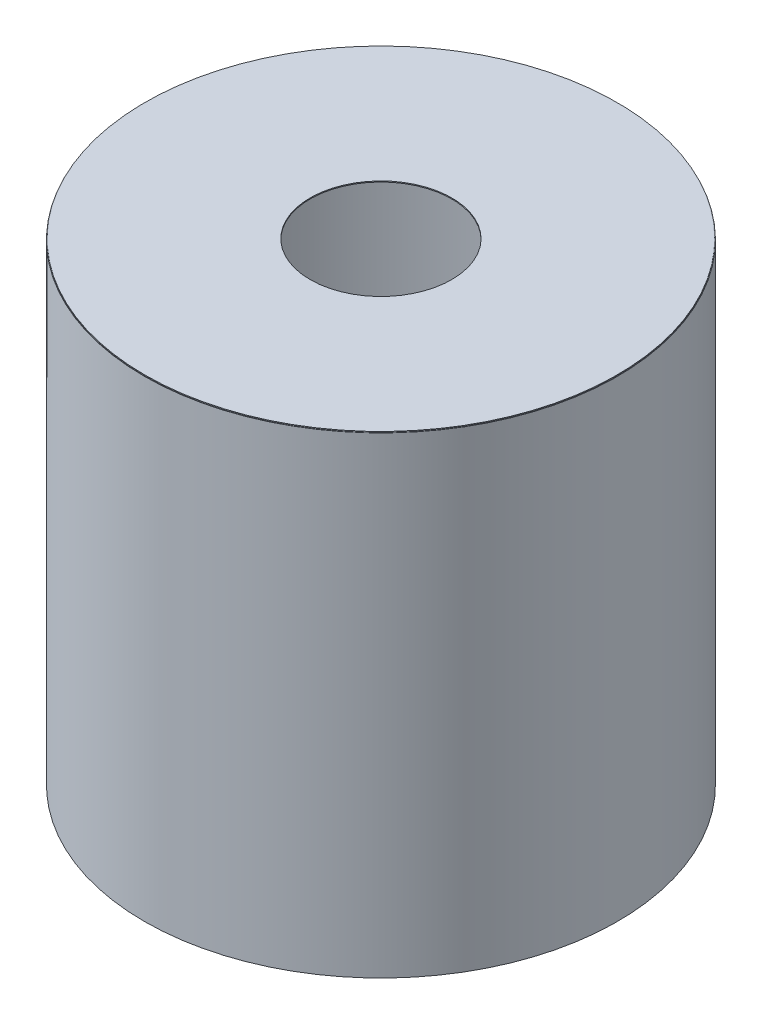
ISO-10303-21;
HEADER;
FILE_DESCRIPTION(('STEP AP214'),'2;1');
FILE_NAME('part.step','',(''),(''),'','','');
FILE_SCHEMA(('AUTOMOTIVE_DESIGN { 1 0 10303 214 1 1 1 1 }'));
ENDSEC;
DATA;
#1=APPLICATION_CONTEXT('core data for automotive mechanical design processes');
#2=APPLICATION_PROTOCOL_DEFINITION('international standard','automotive_design',2000,#1);
#3=PRODUCT_CONTEXT('',#1,'mechanical');
#4=PRODUCT('Part','Part','',(#3));
#5=PRODUCT_RELATED_PRODUCT_CATEGORY('part','',(#4));
#6=PRODUCT_DEFINITION_FORMATION('','',#4);
#7=PRODUCT_DEFINITION_CONTEXT('part definition',#1,'design');
#8=PRODUCT_DEFINITION('design','',#6,#7);
#9=PRODUCT_DEFINITION_SHAPE('','',#8);
#10=(LENGTH_UNIT() NAMED_UNIT(*) SI_UNIT(.MILLI.,.METRE.));
#11=(NAMED_UNIT(*) PLANE_ANGLE_UNIT() SI_UNIT($,.RADIAN.));
#12=(NAMED_UNIT(*) SI_UNIT($,.STERADIAN.) SOLID_ANGLE_UNIT());
#13=UNCERTAINTY_MEASURE_WITH_UNIT(LENGTH_MEASURE(1.E-05),#10,'distance_accuracy_value','');
#14=(GEOMETRIC_REPRESENTATION_CONTEXT(3) GLOBAL_UNCERTAINTY_ASSIGNED_CONTEXT((#13)) GLOBAL_UNIT_ASSIGNED_CONTEXT((#10,
#11,#12)) REPRESENTATION_CONTEXT('',''));
#15=CARTESIAN_POINT('',(0.,0.,0.));
#16=DIRECTION('',(0.,0.,1.));
#17=DIRECTION('',(1.,0.,0.));
#18=AXIS2_PLACEMENT_3D('',#15,#16,#17);
#19=CARTESIAN_POINT('',(0.,1202.,0.));
#20=DIRECTION('',(0.,1.,0.));
#21=DIRECTION('',(0.,0.,1.));
#22=AXIS2_PLACEMENT_3D('',#19,#20,#21);
#23=PLANE('',#22);
#24=CARTESIAN_POINT('',(0.,1202.,0.));
#25=DIRECTION('',(0.,1.,0.));
#26=DIRECTION('',(0.,0.,1.));
#27=AXIS2_PLACEMENT_3D('',#24,#25,#26);
#28=CIRCLE('',#27,450.);
#29=CARTESIAN_POINT('',(0.,1202.,450.));
#30=VERTEX_POINT('',#29);
#31=EDGE_CURVE('E12',#30,#30,#28,.T.);
#32=ORIENTED_EDGE('',*,*,#31,.T.);
#33=EDGE_LOOP('',(#32));
#34=FACE_BOUND('',#33,.T.);
#35=CARTESIAN_POINT('',(0.,1202.,0.));
#36=DIRECTION('',(0.,1.,0.));
#37=DIRECTION('',(0.,0.,1.));
#38=AXIS2_PLACEMENT_3D('',#35,#36,#37);
#39=CIRCLE('',#38,100.);
#40=CARTESIAN_POINT('',(0.,1202.,100.));
#41=VERTEX_POINT('',#40);
#42=EDGE_CURVE('E62',#41,#41,#39,.T.);
#43=ORIENTED_EDGE('',*,*,#42,.F.);
#44=EDGE_LOOP('',(#43));
#45=FACE_BOUND('',#44,.T.);
#46=ADVANCED_FACE('F51',(#34,#45),#23,.T.);
#47=CARTESIAN_POINT('',(0.,1200.,0.));
#48=DIRECTION('',(0.,1.,0.));
#49=DIRECTION('',(0.,0.,1.));
#50=AXIS2_PLACEMENT_3D('',#47,#48,#49);
#51=PLANE('',#50);
#52=CARTESIAN_POINT('',(0.,1200.,0.));
#53=DIRECTION('',(0.,1.,0.));
#54=DIRECTION('',(0.,0.,1.));
#55=AXIS2_PLACEMENT_3D('',#52,#53,#54);
#56=CIRCLE('',#55,450.);
#57=CARTESIAN_POINT('',(0.,1200.,450.));
#58=VERTEX_POINT('',#57);
#59=EDGE_CURVE('E55',#58,#58,#56,.T.);
#60=ORIENTED_EDGE('',*,*,#59,.F.);
#61=EDGE_LOOP('',(#60));
#62=FACE_BOUND('',#61,.T.);
#63=CARTESIAN_POINT('',(0.,1200.,0.));
#64=DIRECTION('',(0.,1.,0.));
#65=DIRECTION('',(0.,0.,1.));
#66=AXIS2_PLACEMENT_3D('',#63,#64,#65);
#67=CIRCLE('',#66,100.);
#68=CARTESIAN_POINT('',(0.,1200.,100.));
#69=VERTEX_POINT('',#68);
#70=EDGE_CURVE('E64',#69,#69,#67,.T.);
#71=ORIENTED_EDGE('',*,*,#70,.T.);
#72=EDGE_LOOP('',(#71));
#73=FACE_BOUND('',#72,.T.);
#74=ADVANCED_FACE('F74',(#62,#73),#51,.F.);
#75=CARTESIAN_POINT('',(0.,1202.,0.));
#76=DIRECTION('',(0.,-1.,0.));
#77=DIRECTION('',(0.,0.,-1.));
#78=AXIS2_PLACEMENT_3D('',#75,#76,#77);
#79=CYLINDRICAL_SURFACE('',#78,450.);
#80=ORIENTED_EDGE('',*,*,#31,.F.);
#81=EDGE_LOOP('',(#80));
#82=FACE_BOUND('',#81,.T.);
#83=ORIENTED_EDGE('',*,*,#59,.T.);
#84=EDGE_LOOP('',(#83));
#85=FACE_BOUND('',#84,.T.);
#86=ADVANCED_FACE('F53',(#82,#85),#79,.T.);
#87=CARTESIAN_POINT('',(0.,1202.,0.));
#88=DIRECTION('',(0.,-1.,0.));
#89=DIRECTION('',(0.,0.,-1.));
#90=AXIS2_PLACEMENT_3D('',#87,#88,#89);
#91=CYLINDRICAL_SURFACE('',#90,100.);
#92=ORIENTED_EDGE('',*,*,#42,.T.);
#93=EDGE_LOOP('',(#92));
#94=FACE_BOUND('',#93,.T.);
#95=ORIENTED_EDGE('',*,*,#70,.F.);
#96=EDGE_LOOP('',(#95));
#97=FACE_BOUND('',#96,.T.);
#98=ADVANCED_FACE('F70',(#94,#97),#91,.F.);
#99=CLOSED_SHELL('',(#46,#74,#86,#98));
#100=MANIFOLD_SOLID_BREP('B2',#99);
#101=CARTESIAN_POINT('',(0.,1802.,0.));
#102=DIRECTION('',(0.,1.,0.));
#103=DIRECTION('',(0.,0.,1.));
#104=AXIS2_PLACEMENT_3D('',#101,#102,#103);
#105=PLANE('',#104);
#106=CARTESIAN_POINT('',(0.,1802.,0.));
#107=DIRECTION('',(0.,1.,0.));
#108=DIRECTION('',(0.,0.,1.));
#109=AXIS2_PLACEMENT_3D('',#106,#107,#108);
#110=CIRCLE('',#109,500.);
#111=CARTESIAN_POINT('',(0.,1802.,500.));
#112=VERTEX_POINT('',#111);
#113=EDGE_CURVE('E50',#112,#112,#110,.T.);
#114=ORIENTED_EDGE('',*,*,#113,.T.);
#115=EDGE_LOOP('',(#114));
#116=FACE_BOUND('',#115,.T.);
#117=CARTESIAN_POINT('',(0.,1802.,0.));
#118=DIRECTION('',(0.,1.,0.));
#119=DIRECTION('',(0.,0.,1.));
#120=AXIS2_PLACEMENT_3D('',#117,#118,#119);
#121=CIRCLE('',#120,150.);
#122=CARTESIAN_POINT('',(0.,1802.,150.));
#123=VERTEX_POINT('',#122);
#124=EDGE_CURVE('E139',#123,#123,#121,.T.);
#125=ORIENTED_EDGE('',*,*,#124,.F.);
#126=EDGE_LOOP('',(#125));
#127=FACE_BOUND('',#126,.T.);
#128=ADVANCED_FACE('F128',(#116,#127),#105,.T.);
#129=CARTESIAN_POINT('',(0.,1800.,0.));
#130=DIRECTION('',(0.,1.,0.));
#131=DIRECTION('',(0.,0.,1.));
#132=AXIS2_PLACEMENT_3D('',#129,#130,#131);
#133=PLANE('',#132);
#134=CARTESIAN_POINT('',(0.,1800.,0.));
#135=DIRECTION('',(0.,1.,0.));
#136=DIRECTION('',(0.,0.,1.));
#137=AXIS2_PLACEMENT_3D('',#134,#135,#136);
#138=CIRCLE('',#137,500.);
#139=CARTESIAN_POINT('',(0.,1800.,500.));
#140=VERTEX_POINT('',#139);
#141=EDGE_CURVE('E132',#140,#140,#138,.T.);
#142=ORIENTED_EDGE('',*,*,#141,.F.);
#143=EDGE_LOOP('',(#142));
#144=FACE_BOUND('',#143,.T.);
#145=CARTESIAN_POINT('',(0.,1800.,0.));
#146=DIRECTION('',(0.,1.,0.));
#147=DIRECTION('',(0.,0.,1.));
#148=AXIS2_PLACEMENT_3D('',#145,#146,#147);
#149=CIRCLE('',#148,150.);
#150=CARTESIAN_POINT('',(0.,1800.,150.));
#151=VERTEX_POINT('',#150);
#152=EDGE_CURVE('E141',#151,#151,#149,.T.);
#153=ORIENTED_EDGE('',*,*,#152,.T.);
#154=EDGE_LOOP('',(#153));
#155=FACE_BOUND('',#154,.T.);
#156=ADVANCED_FACE('F151',(#144,#155),#133,.F.);
#157=CARTESIAN_POINT('',(0.,1802.,0.));
#158=DIRECTION('',(0.,-1.,0.));
#159=DIRECTION('',(0.,0.,-1.));
#160=AXIS2_PLACEMENT_3D('',#157,#158,#159);
#161=CYLINDRICAL_SURFACE('',#160,500.);
#162=ORIENTED_EDGE('',*,*,#113,.F.);
#163=EDGE_LOOP('',(#162));
#164=FACE_BOUND('',#163,.T.);
#165=ORIENTED_EDGE('',*,*,#141,.T.);
#166=EDGE_LOOP('',(#165));
#167=FACE_BOUND('',#166,.T.);
#168=ADVANCED_FACE('F130',(#164,#167),#161,.T.);
#169=CARTESIAN_POINT('',(0.,1802.,0.));
#170=DIRECTION('',(0.,-1.,0.));
#171=DIRECTION('',(0.,0.,-1.));
#172=AXIS2_PLACEMENT_3D('',#169,#170,#171);
#173=CYLINDRICAL_SURFACE('',#172,150.);
#174=ORIENTED_EDGE('',*,*,#124,.T.);
#175=EDGE_LOOP('',(#174));
#176=FACE_BOUND('',#175,.T.);
#177=ORIENTED_EDGE('',*,*,#152,.F.);
#178=EDGE_LOOP('',(#177));
#179=FACE_BOUND('',#178,.T.);
#180=ADVANCED_FACE('F147',(#176,#179),#173,.F.);
#181=CLOSED_SHELL('',(#128,#156,#168,#180));
#182=MANIFOLD_SOLID_BREP('B7',#181);
#183=CARTESIAN_POINT('',(0.,1800.,0.));
#184=DIRECTION('',(0.,1.,0.));
#185=DIRECTION('',(0.,0.,1.));
#186=AXIS2_PLACEMENT_3D('',#183,#184,#185);
#187=PLANE('',#186);
#188=CARTESIAN_POINT('',(0.,1800.,0.));
#189=DIRECTION('',(0.,1.,0.));
#190=DIRECTION('',(0.,0.,1.));
#191=AXIS2_PLACEMENT_3D('',#188,#189,#190);
#192=CIRCLE('',#191,501.);
#193=CARTESIAN_POINT('',(0.,1800.,501.));
#194=VERTEX_POINT('',#193);
#195=EDGE_CURVE('E127',#194,#194,#192,.T.);
#196=ORIENTED_EDGE('',*,*,#195,.T.);
#197=EDGE_LOOP('',(#196));
#198=FACE_BOUND('',#197,.T.);
#199=CARTESIAN_POINT('',(0.,1800.,0.));
#200=DIRECTION('',(0.,1.,0.));
#201=DIRECTION('',(0.,0.,1.));
#202=AXIS2_PLACEMENT_3D('',#199,#200,#201);
#203=CIRCLE('',#202,500.);
#204=CARTESIAN_POINT('',(0.,1800.,500.));
#205=VERTEX_POINT('',#204);
#206=EDGE_CURVE('E208',#205,#205,#203,.T.);
#207=ORIENTED_EDGE('',*,*,#206,.F.);
#208=EDGE_LOOP('',(#207));
#209=FACE_BOUND('',#208,.T.);
#210=ADVANCED_FACE('F197',(#198,#209),#187,.T.);
#211=CARTESIAN_POINT('',(0.,800.,0.));
#212=DIRECTION('',(0.,1.,0.));
#213=DIRECTION('',(0.,0.,1.));
#214=AXIS2_PLACEMENT_3D('',#211,#212,#213);
#215=PLANE('',#214);
#216=CARTESIAN_POINT('',(0.,800.,0.));
#217=DIRECTION('',(0.,1.,0.));
#218=DIRECTION('',(0.,0.,1.));
#219=AXIS2_PLACEMENT_3D('',#216,#217,#218);
#220=CIRCLE('',#219,501.);
#221=CARTESIAN_POINT('',(0.,800.,501.));
#222=VERTEX_POINT('',#221);
#223=EDGE_CURVE('E201',#222,#222,#220,.T.);
#224=ORIENTED_EDGE('',*,*,#223,.F.);
#225=EDGE_LOOP('',(#224));
#226=FACE_BOUND('',#225,.T.);
#227=CARTESIAN_POINT('',(0.,800.,0.));
#228=DIRECTION('',(0.,1.,0.));
#229=DIRECTION('',(0.,0.,1.));
#230=AXIS2_PLACEMENT_3D('',#227,#228,#229);
#231=CIRCLE('',#230,500.);
#232=CARTESIAN_POINT('',(0.,800.,500.));
#233=VERTEX_POINT('',#232);
#234=EDGE_CURVE('E210',#233,#233,#231,.T.);
#235=ORIENTED_EDGE('',*,*,#234,.T.);
#236=EDGE_LOOP('',(#235));
#237=FACE_BOUND('',#236,.T.);
#238=ADVANCED_FACE('F220',(#226,#237),#215,.F.);
#239=CARTESIAN_POINT('',(0.,1800.,0.));
#240=DIRECTION('',(0.,-1.,0.));
#241=DIRECTION('',(0.,0.,-1.));
#242=AXIS2_PLACEMENT_3D('',#239,#240,#241);
#243=CYLINDRICAL_SURFACE('',#242,501.);
#244=ORIENTED_EDGE('',*,*,#195,.F.);
#245=EDGE_LOOP('',(#244));
#246=FACE_BOUND('',#245,.T.);
#247=ORIENTED_EDGE('',*,*,#223,.T.);
#248=EDGE_LOOP('',(#247));
#249=FACE_BOUND('',#248,.T.);
#250=ADVANCED_FACE('F199',(#246,#249),#243,.T.);
#251=CARTESIAN_POINT('',(0.,1800.,0.));
#252=DIRECTION('',(0.,-1.,0.));
#253=DIRECTION('',(0.,0.,-1.));
#254=AXIS2_PLACEMENT_3D('',#251,#252,#253);
#255=CYLINDRICAL_SURFACE('',#254,500.);
#256=ORIENTED_EDGE('',*,*,#206,.T.);
#257=EDGE_LOOP('',(#256));
#258=FACE_BOUND('',#257,.T.);
#259=ORIENTED_EDGE('',*,*,#234,.F.);
#260=EDGE_LOOP('',(#259));
#261=FACE_BOUND('',#260,.T.);
#262=ADVANCED_FACE('F216',(#258,#261),#255,.F.);
#263=CLOSED_SHELL('',(#210,#238,#250,#262));
#264=MANIFOLD_SOLID_BREP('B45',#263);
#265=ADVANCED_BREP_SHAPE_REPRESENTATION('',(#18,#100,#182,#264),#14);
#266=SHAPE_DEFINITION_REPRESENTATION(#9,#265);
ENDSEC;
END-ISO-10303-21;
